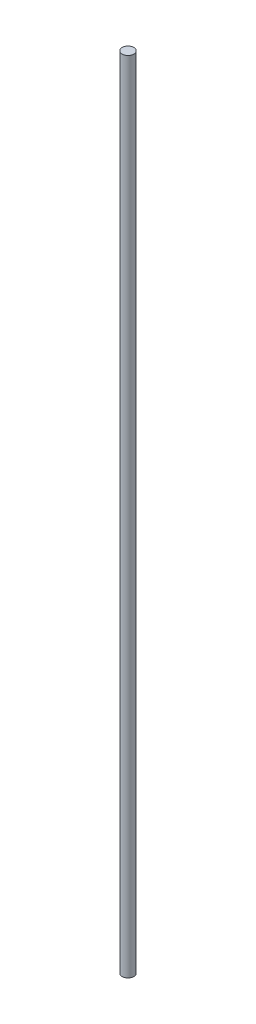
ISO-10303-21;
HEADER;
FILE_DESCRIPTION(('STEP AP214'),'2;1');
FILE_NAME('part.step','',(''),(''),'','','');
FILE_SCHEMA(('AUTOMOTIVE_DESIGN { 1 0 10303 214 1 1 1 1 }'));
ENDSEC;
DATA;
#1=APPLICATION_CONTEXT('core data for automotive mechanical design processes');
#2=APPLICATION_PROTOCOL_DEFINITION('international standard','automotive_design',2000,#1);
#3=PRODUCT_CONTEXT('',#1,'mechanical');
#4=PRODUCT('Part','Part','',(#3));
#5=PRODUCT_RELATED_PRODUCT_CATEGORY('part','',(#4));
#6=PRODUCT_DEFINITION_FORMATION('','',#4);
#7=PRODUCT_DEFINITION_CONTEXT('part definition',#1,'design');
#8=PRODUCT_DEFINITION('design','',#6,#7);
#9=PRODUCT_DEFINITION_SHAPE('','',#8);
#10=(LENGTH_UNIT() NAMED_UNIT(*) SI_UNIT(.MILLI.,.METRE.));
#11=(NAMED_UNIT(*) PLANE_ANGLE_UNIT() SI_UNIT($,.RADIAN.));
#12=(NAMED_UNIT(*) SI_UNIT($,.STERADIAN.) SOLID_ANGLE_UNIT());
#13=UNCERTAINTY_MEASURE_WITH_UNIT(LENGTH_MEASURE(1.E-05),#10,'distance_accuracy_value','');
#14=(GEOMETRIC_REPRESENTATION_CONTEXT(3) GLOBAL_UNCERTAINTY_ASSIGNED_CONTEXT((#13)) GLOBAL_UNIT_ASSIGNED_CONTEXT((#10,
#11,#12)) REPRESENTATION_CONTEXT('',''));
#15=CARTESIAN_POINT('',(0.,0.,0.));
#16=DIRECTION('',(0.,0.,1.));
#17=DIRECTION('',(1.,0.,0.));
#18=AXIS2_PLACEMENT_3D('',#15,#16,#17);
#19=CARTESIAN_POINT('',(0.,275.,0.));
#20=DIRECTION('',(0.,-1.,0.));
#21=DIRECTION('',(0.,0.,-1.));
#22=AXIS2_PLACEMENT_3D('',#19,#20,#21);
#23=CYLINDRICAL_SURFACE('',#22,2.);
#24=CARTESIAN_POINT('',(0.,275.,0.));
#25=DIRECTION('',(0.,1.,0.));
#26=DIRECTION('',(0.,0.,1.));
#27=AXIS2_PLACEMENT_3D('',#24,#25,#26);
#28=CIRCLE('',#27,2.);
#29=CARTESIAN_POINT('',(0.,275.,2.));
#30=VERTEX_POINT('',#29);
#31=EDGE_CURVE('E12',#30,#30,#28,.T.);
#32=ORIENTED_EDGE('',*,*,#31,.F.);
#33=EDGE_LOOP('',(#32));
#34=FACE_BOUND('',#33,.T.);
#35=CARTESIAN_POINT('',(0.,0.,0.));
#36=DIRECTION('',(0.,1.,0.));
#37=DIRECTION('',(0.,0.,1.));
#38=AXIS2_PLACEMENT_3D('',#35,#36,#37);
#39=CIRCLE('',#38,2.);
#40=CARTESIAN_POINT('',(0.,0.,2.));
#41=VERTEX_POINT('',#40);
#42=EDGE_CURVE('E41',#41,#41,#39,.T.);
#43=ORIENTED_EDGE('',*,*,#42,.T.);
#44=EDGE_LOOP('',(#43));
#45=FACE_BOUND('',#44,.T.);
#46=ADVANCED_FACE('F38',(#34,#45),#23,.T.);
#47=CARTESIAN_POINT('',(0.,275.,0.));
#48=DIRECTION('',(0.,1.,0.));
#49=DIRECTION('',(0.,0.,1.));
#50=AXIS2_PLACEMENT_3D('',#47,#48,#49);
#51=PLANE('',#50);
#52=ORIENTED_EDGE('',*,*,#31,.T.);
#53=EDGE_LOOP('',(#52));
#54=FACE_BOUND('',#53,.T.);
#55=ADVANCED_FACE('F53',(#54),#51,.T.);
#56=CARTESIAN_POINT('',(0.,0.,0.));
#57=DIRECTION('',(0.,1.,0.));
#58=DIRECTION('',(0.,0.,1.));
#59=AXIS2_PLACEMENT_3D('',#56,#57,#58);
#60=PLANE('',#59);
#61=ORIENTED_EDGE('',*,*,#42,.F.);
#62=EDGE_LOOP('',(#61));
#63=FACE_BOUND('',#62,.T.);
#64=ADVANCED_FACE('F51',(#63),#60,.F.);
#65=CLOSED_SHELL('',(#46,#55,#64));
#66=MANIFOLD_SOLID_BREP('B2',#65);
#67=ADVANCED_BREP_SHAPE_REPRESENTATION('',(#18,#66),#14);
#68=SHAPE_DEFINITION_REPRESENTATION(#9,#67);
ENDSEC;
END-ISO-10303-21;
